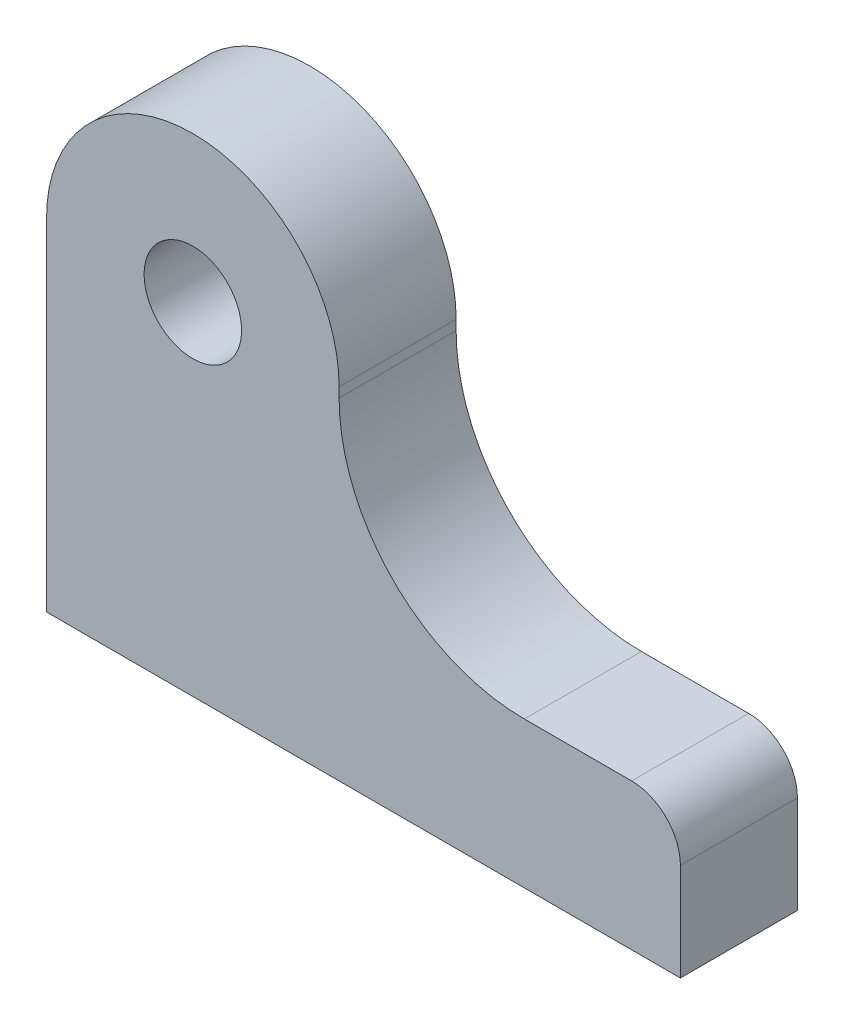
ISO-10303-21;
HEADER;
FILE_DESCRIPTION(('STEP AP214'),'2;1');
FILE_NAME('part.step','',(''),(''),'','','');
FILE_SCHEMA(('AUTOMOTIVE_DESIGN { 1 0 10303 214 1 1 1 1 }'));
ENDSEC;
DATA;
#1=APPLICATION_CONTEXT('core data for automotive mechanical design processes');
#2=APPLICATION_PROTOCOL_DEFINITION('international standard','automotive_design',2000,#1);
#3=PRODUCT_CONTEXT('',#1,'mechanical');
#4=PRODUCT('Part','Part','',(#3));
#5=PRODUCT_RELATED_PRODUCT_CATEGORY('part','',(#4));
#6=PRODUCT_DEFINITION_FORMATION('','',#4);
#7=PRODUCT_DEFINITION_CONTEXT('part definition',#1,'design');
#8=PRODUCT_DEFINITION('design','',#6,#7);
#9=PRODUCT_DEFINITION_SHAPE('','',#8);
#10=(LENGTH_UNIT() NAMED_UNIT(*) SI_UNIT(.MILLI.,.METRE.));
#11=(NAMED_UNIT(*) PLANE_ANGLE_UNIT() SI_UNIT($,.RADIAN.));
#12=(NAMED_UNIT(*) SI_UNIT($,.STERADIAN.) SOLID_ANGLE_UNIT());
#13=UNCERTAINTY_MEASURE_WITH_UNIT(LENGTH_MEASURE(1.E-05),#10,'distance_accuracy_value','');
#14=(GEOMETRIC_REPRESENTATION_CONTEXT(3) GLOBAL_UNCERTAINTY_ASSIGNED_CONTEXT((#13)) GLOBAL_UNIT_ASSIGNED_CONTEXT((#10,
#11,#12)) REPRESENTATION_CONTEXT('',''));
#15=CARTESIAN_POINT('',(0.,0.,0.));
#16=DIRECTION('',(0.,0.,1.));
#17=DIRECTION('',(1.,0.,0.));
#18=AXIS2_PLACEMENT_3D('',#15,#16,#17);
#19=CARTESIAN_POINT('',(0.,0.,12.));
#20=DIRECTION('',(0.,0.,-1.));
#21=DIRECTION('',(-1.,0.,0.));
#22=AXIS2_PLACEMENT_3D('',#19,#20,#21);
#23=PLANE('',#22);
#24=CARTESIAN_POINT('',(-17.5,10.,12.));
#25=DIRECTION('',(0.,0.,-1.));
#26=DIRECTION('',(-1.,0.,0.));
#27=AXIS2_PLACEMENT_3D('',#24,#25,#26);
#28=CIRCLE('',#27,5.);
#29=CARTESIAN_POINT('',(-22.5,10.,12.));
#30=VERTEX_POINT('',#29);
#31=EDGE_CURVE('E186',#30,#30,#28,.T.);
#32=ORIENTED_EDGE('',*,*,#31,.T.);
#33=EDGE_LOOP('',(#32));
#34=FACE_BOUND('',#33,.T.);
#35=CARTESIAN_POINT('',(-17.5,10.,12.));
#36=DIRECTION('',(0.,0.,-1.));
#37=DIRECTION('',(-1.,0.,0.));
#38=AXIS2_PLACEMENT_3D('',#35,#36,#37);
#39=CIRCLE('',#38,15.);
#40=CARTESIAN_POINT('',(-32.5,10.,12.));
#41=VERTEX_POINT('',#40);
#42=CARTESIAN_POINT('',(-2.5,10.,12.));
#43=VERTEX_POINT('',#42);
#44=EDGE_CURVE('E146',#41,#43,#39,.T.);
#45=ORIENTED_EDGE('',*,*,#44,.F.);
#46=DIRECTION('',(0.,-1.,0.));
#47=VECTOR('',#46,1.);
#48=CARTESIAN_POINT('',(-32.5,-25.,12.));
#49=LINE('',#48,#47);
#50=CARTESIAN_POINT('',(-32.5,-25.,12.));
#51=VERTEX_POINT('',#50);
#52=EDGE_CURVE('E125',#41,#51,#49,.T.);
#53=ORIENTED_EDGE('',*,*,#52,.T.);
#54=DIRECTION('',(1.,0.,0.));
#55=VECTOR('',#54,1.);
#56=CARTESIAN_POINT('',(-32.5,-25.,12.));
#57=LINE('',#56,#55);
#58=CARTESIAN_POINT('',(32.5,-25.,12.));
#59=VERTEX_POINT('',#58);
#60=EDGE_CURVE('E87',#51,#59,#57,.T.);
#61=ORIENTED_EDGE('',*,*,#60,.T.);
#62=DIRECTION('',(0.,1.,0.));
#63=VECTOR('',#62,1.);
#64=CARTESIAN_POINT('',(32.5,-25.,12.));
#65=LINE('',#64,#63);
#66=CARTESIAN_POINT('',(32.5,-15.,12.));
#67=VERTEX_POINT('',#66);
#68=EDGE_CURVE('E107',#59,#67,#65,.T.);
#69=ORIENTED_EDGE('',*,*,#68,.T.);
#70=CARTESIAN_POINT('',(27.5,-15.,12.));
#71=DIRECTION('',(0.,0.,-1.));
#72=DIRECTION('',(-1.,0.,0.));
#73=AXIS2_PLACEMENT_3D('',#70,#71,#72);
#74=CIRCLE('',#73,5.);
#75=CARTESIAN_POINT('',(27.5,-10.,12.));
#76=VERTEX_POINT('',#75);
#77=EDGE_CURVE('E159',#76,#67,#74,.T.);
#78=ORIENTED_EDGE('',*,*,#77,.F.);
#79=DIRECTION('',(-1.,0.,0.));
#80=VECTOR('',#79,1.);
#81=CARTESIAN_POINT('',(0.,-10.,12.));
#82=LINE('',#81,#80);
#83=CARTESIAN_POINT('',(16.5,-10.,12.));
#84=VERTEX_POINT('',#83);
#85=EDGE_CURVE('E179',#76,#84,#82,.T.);
#86=ORIENTED_EDGE('',*,*,#85,.T.);
#87=CARTESIAN_POINT('',(16.5,9.,12.));
#88=DIRECTION('',(0.,0.,-1.));
#89=DIRECTION('',(-1.,0.,0.));
#90=AXIS2_PLACEMENT_3D('',#87,#88,#89);
#91=CIRCLE('',#90,19.);
#92=CARTESIAN_POINT('',(-2.5,9.00000000000001,12.));
#93=VERTEX_POINT('',#92);
#94=EDGE_CURVE('E176',#84,#93,#91,.T.);
#95=ORIENTED_EDGE('',*,*,#94,.T.);
#96=DIRECTION('',(0.,-1.,0.));
#97=VECTOR('',#96,1.);
#98=CARTESIAN_POINT('',(-2.5,0.,12.));
#99=LINE('',#98,#97);
#100=EDGE_CURVE('E173',#43,#93,#99,.T.);
#101=ORIENTED_EDGE('',*,*,#100,.F.);
#102=EDGE_LOOP('',(#45,#53,#61,#69,#78,#86,#95,#101));
#103=FACE_BOUND('',#102,.T.);
#104=ADVANCED_FACE('F63',(#34,#103),#23,.F.);
#105=CARTESIAN_POINT('',(0.,0.,0.));
#106=DIRECTION('',(0.,0.,-1.));
#107=DIRECTION('',(-1.,0.,0.));
#108=AXIS2_PLACEMENT_3D('',#105,#106,#107);
#109=PLANE('',#108);
#110=CARTESIAN_POINT('',(-17.5,10.,0.));
#111=DIRECTION('',(0.,0.,-1.));
#112=DIRECTION('',(-1.,0.,0.));
#113=AXIS2_PLACEMENT_3D('',#110,#111,#112);
#114=CIRCLE('',#113,5.);
#115=CARTESIAN_POINT('',(-22.5,10.,0.));
#116=VERTEX_POINT('',#115);
#117=EDGE_CURVE('E187',#116,#116,#114,.T.);
#118=ORIENTED_EDGE('',*,*,#117,.F.);
#119=EDGE_LOOP('',(#118));
#120=FACE_BOUND('',#119,.T.);
#121=DIRECTION('',(0.,-1.,0.));
#122=VECTOR('',#121,1.);
#123=CARTESIAN_POINT('',(-32.5,-25.,0.));
#124=LINE('',#123,#122);
#125=CARTESIAN_POINT('',(-32.5,10.,0.));
#126=VERTEX_POINT('',#125);
#127=CARTESIAN_POINT('',(-32.5,-25.,0.));
#128=VERTEX_POINT('',#127);
#129=EDGE_CURVE('E108',#126,#128,#124,.T.);
#130=ORIENTED_EDGE('',*,*,#129,.F.);
#131=CARTESIAN_POINT('',(-17.5,10.,0.));
#132=DIRECTION('',(0.,0.,-1.));
#133=DIRECTION('',(-1.,0.,0.));
#134=AXIS2_PLACEMENT_3D('',#131,#132,#133);
#135=CIRCLE('',#134,15.);
#136=CARTESIAN_POINT('',(-2.5,10.,0.));
#137=VERTEX_POINT('',#136);
#138=EDGE_CURVE('E156',#126,#137,#135,.T.);
#139=ORIENTED_EDGE('',*,*,#138,.T.);
#140=DIRECTION('',(0.,-1.,0.));
#141=VECTOR('',#140,1.);
#142=CARTESIAN_POINT('',(-2.5,0.,0.));
#143=LINE('',#142,#141);
#144=CARTESIAN_POINT('',(-2.5,9.00000000000001,0.));
#145=VERTEX_POINT('',#144);
#146=EDGE_CURVE('E160',#137,#145,#143,.T.);
#147=ORIENTED_EDGE('',*,*,#146,.T.);
#148=CARTESIAN_POINT('',(16.5,9.,0.));
#149=DIRECTION('',(0.,0.,-1.));
#150=DIRECTION('',(-1.,0.,0.));
#151=AXIS2_PLACEMENT_3D('',#148,#149,#150);
#152=CIRCLE('',#151,19.);
#153=CARTESIAN_POINT('',(16.5,-10.,0.));
#154=VERTEX_POINT('',#153);
#155=EDGE_CURVE('E163',#154,#145,#152,.T.);
#156=ORIENTED_EDGE('',*,*,#155,.F.);
#157=DIRECTION('',(-1.,0.,0.));
#158=VECTOR('',#157,1.);
#159=CARTESIAN_POINT('',(0.,-10.,0.));
#160=LINE('',#159,#158);
#161=CARTESIAN_POINT('',(27.5,-10.,0.));
#162=VERTEX_POINT('',#161);
#163=EDGE_CURVE('E166',#162,#154,#160,.T.);
#164=ORIENTED_EDGE('',*,*,#163,.F.);
#165=CARTESIAN_POINT('',(27.5,-15.,0.));
#166=DIRECTION('',(0.,0.,-1.));
#167=DIRECTION('',(-1.,0.,0.));
#168=AXIS2_PLACEMENT_3D('',#165,#166,#167);
#169=CIRCLE('',#168,5.);
#170=CARTESIAN_POINT('',(32.5,-15.,0.));
#171=VERTEX_POINT('',#170);
#172=EDGE_CURVE('E78',#162,#171,#169,.T.);
#173=ORIENTED_EDGE('',*,*,#172,.T.);
#174=DIRECTION('',(0.,1.,0.));
#175=VECTOR('',#174,1.);
#176=CARTESIAN_POINT('',(32.5,-25.,0.));
#177=LINE('',#176,#175);
#178=CARTESIAN_POINT('',(32.5,-25.,0.));
#179=VERTEX_POINT('',#178);
#180=EDGE_CURVE('E114',#179,#171,#177,.T.);
#181=ORIENTED_EDGE('',*,*,#180,.F.);
#182=DIRECTION('',(1.,0.,0.));
#183=VECTOR('',#182,1.);
#184=CARTESIAN_POINT('',(-32.5,-25.,0.));
#185=LINE('',#184,#183);
#186=EDGE_CURVE('E99',#128,#179,#185,.T.);
#187=ORIENTED_EDGE('',*,*,#186,.F.);
#188=EDGE_LOOP('',(#130,#139,#147,#156,#164,#173,#181,#187));
#189=FACE_BOUND('',#188,.T.);
#190=ADVANCED_FACE('F115',(#120,#189),#109,.T.);
#191=CARTESIAN_POINT('',(32.5,-25.,12.));
#192=DIRECTION('',(-1.,0.,0.));
#193=DIRECTION('',(0.,0.,1.));
#194=AXIS2_PLACEMENT_3D('',#191,#192,#193);
#195=PLANE('',#194);
#196=DIRECTION('',(0.,0.,-1.));
#197=VECTOR('',#196,1.);
#198=CARTESIAN_POINT('',(32.5,-15.,12.));
#199=LINE('',#198,#197);
#200=EDGE_CURVE('E132',#67,#171,#199,.T.);
#201=ORIENTED_EDGE('',*,*,#200,.F.);
#202=ORIENTED_EDGE('',*,*,#68,.F.);
#203=DIRECTION('',(0.,0.,-1.));
#204=VECTOR('',#203,1.);
#205=CARTESIAN_POINT('',(32.5,-25.,12.));
#206=LINE('',#205,#204);
#207=EDGE_CURVE('E71',#59,#179,#206,.T.);
#208=ORIENTED_EDGE('',*,*,#207,.T.);
#209=ORIENTED_EDGE('',*,*,#180,.T.);
#210=EDGE_LOOP('',(#201,#202,#208,#209));
#211=FACE_BOUND('',#210,.T.);
#212=ADVANCED_FACE('F65',(#211),#195,.F.);
#213=CARTESIAN_POINT('',(-32.5,-25.,12.));
#214=DIRECTION('',(1.,0.,0.));
#215=DIRECTION('',(0.,0.,-1.));
#216=AXIS2_PLACEMENT_3D('',#213,#214,#215);
#217=PLANE('',#216);
#218=CARTESIAN_POINT('',(-32.5,-15.,5.));
#219=DIRECTION('',(-1.,0.,0.));
#220=DIRECTION('',(0.,0.,1.));
#221=AXIS2_PLACEMENT_3D('',#218,#219,#220);
#222=CIRCLE('',#221,2.5);
#223=CARTESIAN_POINT('',(-32.5,-15.,7.5));
#224=VERTEX_POINT('',#223);
#225=EDGE_CURVE('E193',#224,#224,#222,.T.);
#226=ORIENTED_EDGE('',*,*,#225,.F.);
#227=EDGE_LOOP('',(#226));
#228=FACE_BOUND('',#227,.T.);
#229=ORIENTED_EDGE('',*,*,#52,.F.);
#230=DIRECTION('',(0.,0.,-1.));
#231=VECTOR('',#230,1.);
#232=CARTESIAN_POINT('',(-32.5,10.,12.));
#233=LINE('',#232,#231);
#234=EDGE_CURVE('E170',#41,#126,#233,.T.);
#235=ORIENTED_EDGE('',*,*,#234,.T.);
#236=ORIENTED_EDGE('',*,*,#129,.T.);
#237=DIRECTION('',(0.,0.,-1.));
#238=VECTOR('',#237,1.);
#239=CARTESIAN_POINT('',(-32.5,-25.,12.));
#240=LINE('',#239,#238);
#241=EDGE_CURVE('E12',#51,#128,#240,.T.);
#242=ORIENTED_EDGE('',*,*,#241,.F.);
#243=EDGE_LOOP('',(#229,#235,#236,#242));
#244=FACE_BOUND('',#243,.T.);
#245=ADVANCED_FACE('F208',(#228,#244),#217,.F.);
#246=CARTESIAN_POINT('',(-32.5,-25.,12.));
#247=DIRECTION('',(0.,1.,0.));
#248=DIRECTION('',(0.,0.,1.));
#249=AXIS2_PLACEMENT_3D('',#246,#247,#248);
#250=PLANE('',#249);
#251=CARTESIAN_POINT('',(-7.50000000000001,-25.,6.));
#252=DIRECTION('',(0.,-1.,0.));
#253=DIRECTION('',(0.,0.,-1.));
#254=AXIS2_PLACEMENT_3D('',#251,#252,#253);
#255=CIRCLE('',#254,2.5);
#256=CARTESIAN_POINT('',(-7.50000000000001,-25.,3.5));
#257=VERTEX_POINT('',#256);
#258=EDGE_CURVE('E121',#257,#257,#255,.T.);
#259=ORIENTED_EDGE('',*,*,#258,.F.);
#260=EDGE_LOOP('',(#259));
#261=FACE_BOUND('',#260,.T.);
#262=CARTESIAN_POINT('',(7.49999999999999,-25.,6.));
#263=DIRECTION('',(0.,-1.,0.));
#264=DIRECTION('',(0.,0.,-1.));
#265=AXIS2_PLACEMENT_3D('',#262,#263,#264);
#266=CIRCLE('',#265,2.5);
#267=CARTESIAN_POINT('',(7.49999999999999,-25.,3.5));
#268=VERTEX_POINT('',#267);
#269=EDGE_CURVE('E135',#268,#268,#266,.T.);
#270=ORIENTED_EDGE('',*,*,#269,.F.);
#271=EDGE_LOOP('',(#270));
#272=FACE_BOUND('',#271,.T.);
#273=CARTESIAN_POINT('',(22.5,-25.,6.));
#274=DIRECTION('',(0.,-1.,0.));
#275=DIRECTION('',(0.,0.,-1.));
#276=AXIS2_PLACEMENT_3D('',#273,#274,#275);
#277=CIRCLE('',#276,2.5);
#278=CARTESIAN_POINT('',(22.5,-25.,3.5));
#279=VERTEX_POINT('',#278);
#280=EDGE_CURVE('E128',#279,#279,#277,.T.);
#281=ORIENTED_EDGE('',*,*,#280,.F.);
#282=EDGE_LOOP('',(#281));
#283=FACE_BOUND('',#282,.T.);
#284=ORIENTED_EDGE('',*,*,#186,.T.);
#285=ORIENTED_EDGE('',*,*,#207,.F.);
#286=ORIENTED_EDGE('',*,*,#60,.F.);
#287=ORIENTED_EDGE('',*,*,#241,.T.);
#288=EDGE_LOOP('',(#284,#285,#286,#287));
#289=FACE_BOUND('',#288,.T.);
#290=ADVANCED_FACE('F101',(#261,#272,#283,#289),#250,.F.);
#291=CARTESIAN_POINT('',(22.5,-15.,6.));
#292=DIRECTION('',(0.,-1.,0.));
#293=DIRECTION('',(0.,0.,-1.));
#294=AXIS2_PLACEMENT_3D('',#291,#292,#293);
#295=CYLINDRICAL_SURFACE('',#294,2.5);
#296=CARTESIAN_POINT('',(22.5,-15.,6.));
#297=DIRECTION('',(0.,-1.,0.));
#298=DIRECTION('',(0.,0.,-1.));
#299=AXIS2_PLACEMENT_3D('',#296,#297,#298);
#300=CIRCLE('',#299,2.5);
#301=CARTESIAN_POINT('',(22.5,-15.,3.5));
#302=VERTEX_POINT('',#301);
#303=EDGE_CURVE('E131',#302,#302,#300,.T.);
#304=ORIENTED_EDGE('',*,*,#303,.F.);
#305=EDGE_LOOP('',(#304));
#306=FACE_BOUND('',#305,.T.);
#307=ORIENTED_EDGE('',*,*,#280,.T.);
#308=EDGE_LOOP('',(#307));
#309=FACE_BOUND('',#308,.T.);
#310=ADVANCED_FACE('F269',(#306,#309),#295,.F.);
#311=CARTESIAN_POINT('',(22.5,-15.,6.));
#312=DIRECTION('',(0.,-1.,0.));
#313=DIRECTION('',(0.,0.,-1.));
#314=AXIS2_PLACEMENT_3D('',#311,#312,#313);
#315=PLANE('',#314);
#316=ORIENTED_EDGE('',*,*,#303,.T.);
#317=EDGE_LOOP('',(#316));
#318=FACE_BOUND('',#317,.T.);
#319=ADVANCED_FACE('F277',(#318),#315,.T.);
#320=CARTESIAN_POINT('',(7.49999999999999,-15.,6.));
#321=DIRECTION('',(0.,-1.,0.));
#322=DIRECTION('',(0.,0.,-1.));
#323=AXIS2_PLACEMENT_3D('',#320,#321,#322);
#324=CYLINDRICAL_SURFACE('',#323,2.5);
#325=CARTESIAN_POINT('',(7.49999999999999,-15.,6.));
#326=DIRECTION('',(0.,-1.,0.));
#327=DIRECTION('',(0.,0.,-1.));
#328=AXIS2_PLACEMENT_3D('',#325,#326,#327);
#329=CIRCLE('',#328,2.5);
#330=CARTESIAN_POINT('',(7.49999999999999,-15.,3.5));
#331=VERTEX_POINT('',#330);
#332=EDGE_CURVE('E138',#331,#331,#329,.T.);
#333=ORIENTED_EDGE('',*,*,#332,.F.);
#334=EDGE_LOOP('',(#333));
#335=FACE_BOUND('',#334,.T.);
#336=ORIENTED_EDGE('',*,*,#269,.T.);
#337=EDGE_LOOP('',(#336));
#338=FACE_BOUND('',#337,.T.);
#339=ADVANCED_FACE('F286',(#335,#338),#324,.F.);
#340=CARTESIAN_POINT('',(7.49999999999999,-15.,6.));
#341=DIRECTION('',(0.,-1.,0.));
#342=DIRECTION('',(0.,0.,-1.));
#343=AXIS2_PLACEMENT_3D('',#340,#341,#342);
#344=PLANE('',#343);
#345=ORIENTED_EDGE('',*,*,#332,.T.);
#346=EDGE_LOOP('',(#345));
#347=FACE_BOUND('',#346,.T.);
#348=ADVANCED_FACE('F288',(#347),#344,.T.);
#349=CARTESIAN_POINT('',(-7.50000000000001,-15.,6.));
#350=DIRECTION('',(0.,-1.,0.));
#351=DIRECTION('',(0.,0.,-1.));
#352=AXIS2_PLACEMENT_3D('',#349,#350,#351);
#353=CYLINDRICAL_SURFACE('',#352,2.5);
#354=CARTESIAN_POINT('',(-7.50000000000001,-15.,6.));
#355=DIRECTION('',(0.,-1.,0.));
#356=DIRECTION('',(0.,0.,-1.));
#357=AXIS2_PLACEMENT_3D('',#354,#355,#356);
#358=CIRCLE('',#357,2.5);
#359=CARTESIAN_POINT('',(-7.50000000000001,-15.,3.5));
#360=VERTEX_POINT('',#359);
#361=EDGE_CURVE('E117',#360,#360,#358,.T.);
#362=ORIENTED_EDGE('',*,*,#361,.F.);
#363=EDGE_LOOP('',(#362));
#364=FACE_BOUND('',#363,.T.);
#365=ORIENTED_EDGE('',*,*,#258,.T.);
#366=EDGE_LOOP('',(#365));
#367=FACE_BOUND('',#366,.T.);
#368=ADVANCED_FACE('F295',(#364,#367),#353,.F.);
#369=CARTESIAN_POINT('',(-7.50000000000001,-15.,6.));
#370=DIRECTION('',(0.,-1.,0.));
#371=DIRECTION('',(0.,0.,-1.));
#372=AXIS2_PLACEMENT_3D('',#369,#370,#371);
#373=PLANE('',#372);
#374=ORIENTED_EDGE('',*,*,#361,.T.);
#375=EDGE_LOOP('',(#374));
#376=FACE_BOUND('',#375,.T.);
#377=ADVANCED_FACE('F303',(#376),#373,.T.);
#378=CARTESIAN_POINT('',(27.5,-15.,12.));
#379=DIRECTION('',(0.,0.,-1.));
#380=DIRECTION('',(-1.,0.,0.));
#381=AXIS2_PLACEMENT_3D('',#378,#379,#380);
#382=CYLINDRICAL_SURFACE('',#381,5.);
#383=ORIENTED_EDGE('',*,*,#172,.F.);
#384=DIRECTION('',(0.,0.,-1.));
#385=VECTOR('',#384,1.);
#386=CARTESIAN_POINT('',(27.5,-10.,12.));
#387=LINE('',#386,#385);
#388=EDGE_CURVE('E143',#76,#162,#387,.T.);
#389=ORIENTED_EDGE('',*,*,#388,.F.);
#390=ORIENTED_EDGE('',*,*,#77,.T.);
#391=ORIENTED_EDGE('',*,*,#200,.T.);
#392=EDGE_LOOP('',(#383,#389,#390,#391));
#393=FACE_BOUND('',#392,.T.);
#394=ADVANCED_FACE('F242',(#393),#382,.T.);
#395=CARTESIAN_POINT('',(-17.5,10.,12.));
#396=DIRECTION('',(0.,0.,-1.));
#397=DIRECTION('',(-1.,0.,0.));
#398=AXIS2_PLACEMENT_3D('',#395,#396,#397);
#399=CYLINDRICAL_SURFACE('',#398,15.);
#400=ORIENTED_EDGE('',*,*,#138,.F.);
#401=ORIENTED_EDGE('',*,*,#234,.F.);
#402=ORIENTED_EDGE('',*,*,#44,.T.);
#403=DIRECTION('',(0.,0.,-1.));
#404=VECTOR('',#403,1.);
#405=CARTESIAN_POINT('',(-2.5,10.,12.));
#406=LINE('',#405,#404);
#407=EDGE_CURVE('E152',#43,#137,#406,.T.);
#408=ORIENTED_EDGE('',*,*,#407,.T.);
#409=EDGE_LOOP('',(#400,#401,#402,#408));
#410=FACE_BOUND('',#409,.T.);
#411=ADVANCED_FACE('F223',(#410),#399,.T.);
#412=CARTESIAN_POINT('',(-2.5,0.,12.));
#413=DIRECTION('',(1.,0.,0.));
#414=DIRECTION('',(0.,0.,-1.));
#415=AXIS2_PLACEMENT_3D('',#412,#413,#414);
#416=PLANE('',#415);
#417=ORIENTED_EDGE('',*,*,#146,.F.);
#418=ORIENTED_EDGE('',*,*,#407,.F.);
#419=ORIENTED_EDGE('',*,*,#100,.T.);
#420=DIRECTION('',(0.,0.,-1.));
#421=VECTOR('',#420,1.);
#422=CARTESIAN_POINT('',(-2.5,9.00000000000001,12.));
#423=LINE('',#422,#421);
#424=EDGE_CURVE('E149',#93,#145,#423,.T.);
#425=ORIENTED_EDGE('',*,*,#424,.T.);
#426=EDGE_LOOP('',(#417,#418,#419,#425));
#427=FACE_BOUND('',#426,.T.);
#428=ADVANCED_FACE('F251',(#427),#416,.T.);
#429=CARTESIAN_POINT('',(16.5,9.,12.));
#430=DIRECTION('',(0.,0.,-1.));
#431=DIRECTION('',(-1.,0.,0.));
#432=AXIS2_PLACEMENT_3D('',#429,#430,#431);
#433=CYLINDRICAL_SURFACE('',#432,19.);
#434=ORIENTED_EDGE('',*,*,#155,.T.);
#435=ORIENTED_EDGE('',*,*,#424,.F.);
#436=ORIENTED_EDGE('',*,*,#94,.F.);
#437=DIRECTION('',(0.,0.,-1.));
#438=VECTOR('',#437,1.);
#439=CARTESIAN_POINT('',(16.5,-10.,12.));
#440=LINE('',#439,#438);
#441=EDGE_CURVE('E145',#84,#154,#440,.T.);
#442=ORIENTED_EDGE('',*,*,#441,.T.);
#443=EDGE_LOOP('',(#434,#435,#436,#442));
#444=FACE_BOUND('',#443,.T.);
#445=ADVANCED_FACE('F249',(#444),#433,.F.);
#446=CARTESIAN_POINT('',(0.,-10.,12.));
#447=DIRECTION('',(0.,-1.,0.));
#448=DIRECTION('',(0.,0.,-1.));
#449=AXIS2_PLACEMENT_3D('',#446,#447,#448);
#450=PLANE('',#449);
#451=ORIENTED_EDGE('',*,*,#163,.T.);
#452=ORIENTED_EDGE('',*,*,#441,.F.);
#453=ORIENTED_EDGE('',*,*,#85,.F.);
#454=ORIENTED_EDGE('',*,*,#388,.T.);
#455=EDGE_LOOP('',(#451,#452,#453,#454));
#456=FACE_BOUND('',#455,.T.);
#457=ADVANCED_FACE('F245',(#456),#450,.F.);
#458=CARTESIAN_POINT('',(-17.5,10.,12.));
#459=DIRECTION('',(0.,0.,-1.));
#460=DIRECTION('',(-1.,0.,0.));
#461=AXIS2_PLACEMENT_3D('',#458,#459,#460);
#462=CYLINDRICAL_SURFACE('',#461,5.);
#463=ORIENTED_EDGE('',*,*,#31,.F.);
#464=EDGE_LOOP('',(#463));
#465=FACE_BOUND('',#464,.T.);
#466=ORIENTED_EDGE('',*,*,#117,.T.);
#467=EDGE_LOOP('',(#466));
#468=FACE_BOUND('',#467,.T.);
#469=ADVANCED_FACE('F204',(#465,#468),#462,.F.);
#470=CARTESIAN_POINT('',(-22.5,-15.,5.));
#471=DIRECTION('',(-1.,0.,0.));
#472=DIRECTION('',(0.,0.,1.));
#473=AXIS2_PLACEMENT_3D('',#470,#471,#472);
#474=CYLINDRICAL_SURFACE('',#473,2.5);
#475=CARTESIAN_POINT('',(-22.5,-15.,5.));
#476=DIRECTION('',(-1.,0.,0.));
#477=DIRECTION('',(0.,0.,1.));
#478=AXIS2_PLACEMENT_3D('',#475,#476,#477);
#479=CIRCLE('',#478,2.5);
#480=CARTESIAN_POINT('',(-22.5,-15.,7.5));
#481=VERTEX_POINT('',#480);
#482=EDGE_CURVE('E190',#481,#481,#479,.T.);
#483=ORIENTED_EDGE('',*,*,#482,.F.);
#484=EDGE_LOOP('',(#483));
#485=FACE_BOUND('',#484,.T.);
#486=ORIENTED_EDGE('',*,*,#225,.T.);
#487=EDGE_LOOP('',(#486));
#488=FACE_BOUND('',#487,.T.);
#489=ADVANCED_FACE('F201',(#485,#488),#474,.F.);
#490=CARTESIAN_POINT('',(-22.5,-15.,5.));
#491=DIRECTION('',(-1.,0.,0.));
#492=DIRECTION('',(0.,0.,1.));
#493=AXIS2_PLACEMENT_3D('',#490,#491,#492);
#494=PLANE('',#493);
#495=ORIENTED_EDGE('',*,*,#482,.T.);
#496=EDGE_LOOP('',(#495));
#497=FACE_BOUND('',#496,.T.);
#498=ADVANCED_FACE('F199',(#497),#494,.T.);
#499=CLOSED_SHELL('',(#104,#190,#212,#245,#290,#310,#319,#339,#348,#368,#377,#394,#411,#428,
#445,#457,#469,#489,#498));
#500=MANIFOLD_SOLID_BREP('B2',#499);
#501=ADVANCED_BREP_SHAPE_REPRESENTATION('',(#18,#500),#14);
#502=SHAPE_DEFINITION_REPRESENTATION(#9,#501);
ENDSEC;
END-ISO-10303-21;
